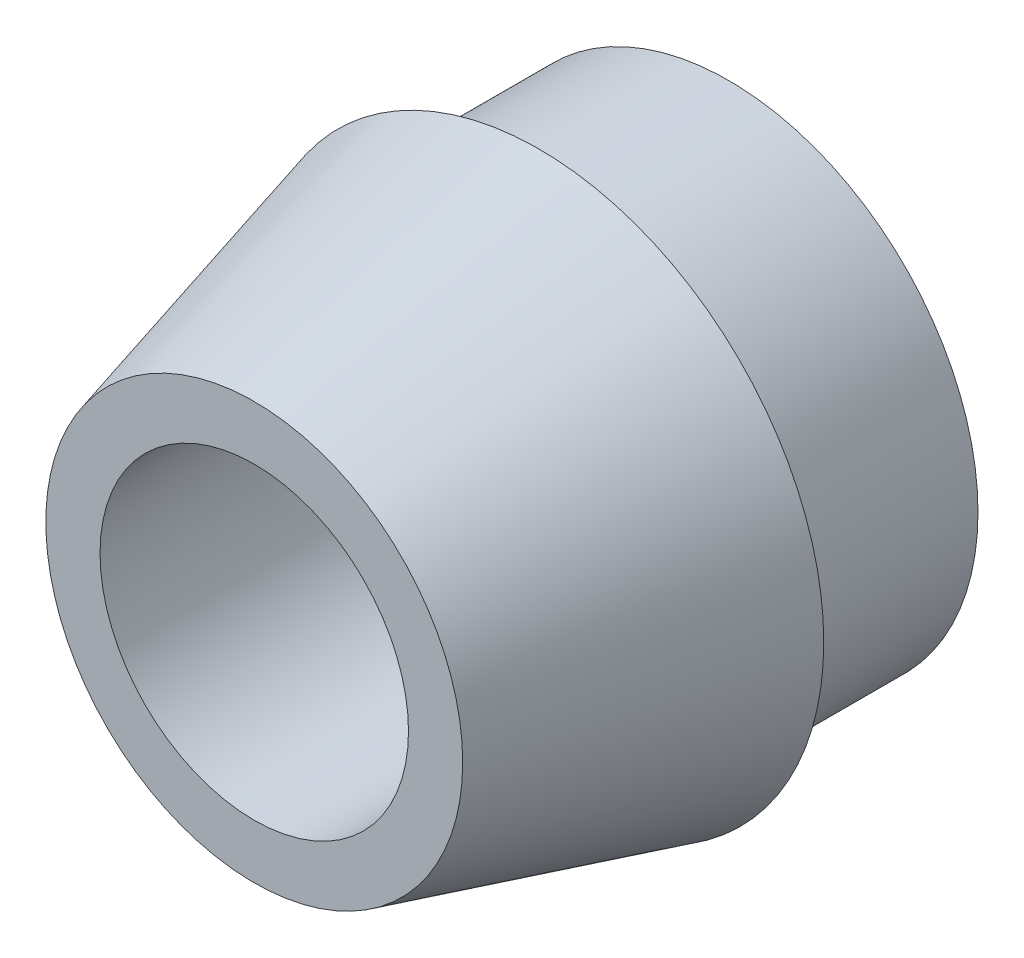
ISO-10303-21;
HEADER;
FILE_DESCRIPTION(('STEP AP214'),'2;1');
FILE_NAME('part.step','',(''),(''),'','','');
FILE_SCHEMA(('AUTOMOTIVE_DESIGN { 1 0 10303 214 1 1 1 1 }'));
ENDSEC;
DATA;
#1=APPLICATION_CONTEXT('core data for automotive mechanical design processes');
#2=APPLICATION_PROTOCOL_DEFINITION('international standard','automotive_design',2000,#1);
#3=PRODUCT_CONTEXT('',#1,'mechanical');
#4=PRODUCT('Part','Part','',(#3));
#5=PRODUCT_RELATED_PRODUCT_CATEGORY('part','',(#4));
#6=PRODUCT_DEFINITION_FORMATION('','',#4);
#7=PRODUCT_DEFINITION_CONTEXT('part definition',#1,'design');
#8=PRODUCT_DEFINITION('design','',#6,#7);
#9=PRODUCT_DEFINITION_SHAPE('','',#8);
#10=(LENGTH_UNIT() NAMED_UNIT(*) SI_UNIT(.MILLI.,.METRE.));
#11=(NAMED_UNIT(*) PLANE_ANGLE_UNIT() SI_UNIT($,.RADIAN.));
#12=(NAMED_UNIT(*) SI_UNIT($,.STERADIAN.) SOLID_ANGLE_UNIT());
#13=UNCERTAINTY_MEASURE_WITH_UNIT(LENGTH_MEASURE(1.E-05),#10,'distance_accuracy_value','');
#14=(GEOMETRIC_REPRESENTATION_CONTEXT(3) GLOBAL_UNCERTAINTY_ASSIGNED_CONTEXT((#13)) GLOBAL_UNIT_ASSIGNED_CONTEXT((#10,
#11,#12)) REPRESENTATION_CONTEXT('',''));
#15=CARTESIAN_POINT('',(0.,0.,0.));
#16=DIRECTION('',(0.,0.,1.));
#17=DIRECTION('',(1.,0.,0.));
#18=AXIS2_PLACEMENT_3D('',#15,#16,#17);
#19=CARTESIAN_POINT('',(0.,0.,0.));
#20=DIRECTION('',(0.,0.,1.));
#21=DIRECTION('',(1.,0.,0.));
#22=AXIS2_PLACEMENT_3D('',#19,#20,#21);
#23=PLANE('',#22);
#24=CARTESIAN_POINT('',(0.,0.,0.));
#25=DIRECTION('',(0.,0.,1.));
#26=DIRECTION('',(1.,0.,0.));
#27=AXIS2_PLACEMENT_3D('',#24,#25,#26);
#28=CIRCLE('',#27,52.5);
#29=CARTESIAN_POINT('',(52.5,0.,0.));
#30=VERTEX_POINT('',#29);
#31=EDGE_CURVE('E44',#30,#30,#28,.T.);
#32=ORIENTED_EDGE('',*,*,#31,.F.);
#33=EDGE_LOOP('',(#32));
#34=FACE_BOUND('',#33,.T.);
#35=CARTESIAN_POINT('',(0.,0.,0.));
#36=DIRECTION('',(0.,0.,1.));
#37=DIRECTION('',(1.,0.,0.));
#38=AXIS2_PLACEMENT_3D('',#35,#36,#37);
#39=CIRCLE('',#38,41.35);
#40=CARTESIAN_POINT('',(41.35,0.,0.));
#41=VERTEX_POINT('',#40);
#42=EDGE_CURVE('E51',#41,#41,#39,.T.);
#43=ORIENTED_EDGE('',*,*,#42,.T.);
#44=EDGE_LOOP('',(#43));
#45=FACE_BOUND('',#44,.T.);
#46=ADVANCED_FACE('F40',(#34,#45),#23,.F.);
#47=CARTESIAN_POINT('',(0.,0.,40.));
#48=DIRECTION('',(0.,0.,-1.));
#49=DIRECTION('',(-1.,0.,0.));
#50=AXIS2_PLACEMENT_3D('',#47,#48,#49);
#51=CYLINDRICAL_SURFACE('',#50,52.5);
#52=CARTESIAN_POINT('',(0.,0.,40.));
#53=DIRECTION('',(0.,0.,1.));
#54=DIRECTION('',(1.,0.,0.));
#55=AXIS2_PLACEMENT_3D('',#52,#53,#54);
#56=CIRCLE('',#55,52.5);
#57=CARTESIAN_POINT('',(52.5,0.,40.));
#58=VERTEX_POINT('',#57);
#59=EDGE_CURVE('E10',#58,#58,#56,.T.);
#60=ORIENTED_EDGE('',*,*,#59,.F.);
#61=EDGE_LOOP('',(#60));
#62=FACE_BOUND('',#61,.T.);
#63=ORIENTED_EDGE('',*,*,#31,.T.);
#64=EDGE_LOOP('',(#63));
#65=FACE_BOUND('',#64,.T.);
#66=ADVANCED_FACE('F42',(#62,#65),#51,.T.);
#67=CARTESIAN_POINT('',(0.,0.,40.));
#68=DIRECTION('',(0.,0.,-1.));
#69=DIRECTION('',(-1.,0.,0.));
#70=AXIS2_PLACEMENT_3D('',#67,#68,#69);
#71=CYLINDRICAL_SURFACE('',#70,41.35);
#72=CARTESIAN_POINT('',(0.,0.,40.));
#73=DIRECTION('',(0.,0.,1.));
#74=DIRECTION('',(1.,0.,0.));
#75=AXIS2_PLACEMENT_3D('',#72,#73,#74);
#76=CIRCLE('',#75,41.35);
#77=CARTESIAN_POINT('',(41.35,0.,40.));
#78=VERTEX_POINT('',#77);
#79=EDGE_CURVE('E55',#78,#78,#76,.T.);
#80=ORIENTED_EDGE('',*,*,#79,.T.);
#81=EDGE_LOOP('',(#80));
#82=FACE_BOUND('',#81,.T.);
#83=ORIENTED_EDGE('',*,*,#42,.F.);
#84=EDGE_LOOP('',(#83));
#85=FACE_BOUND('',#84,.T.);
#86=ADVANCED_FACE('F95',(#82,#85),#71,.F.);
#87=CARTESIAN_POINT('',(0.,0.,40.));
#88=DIRECTION('',(0.,0.,1.));
#89=DIRECTION('',(1.,0.,0.));
#90=AXIS2_PLACEMENT_3D('',#87,#88,#89);
#91=PLANE('',#90);
#92=CARTESIAN_POINT('',(0.,0.,40.));
#93=DIRECTION('',(0.,0.,1.));
#94=DIRECTION('',(1.,0.,0.));
#95=AXIS2_PLACEMENT_3D('',#92,#93,#94);
#96=CIRCLE('',#95,32.5);
#97=CARTESIAN_POINT('',(32.5,0.,40.));
#98=VERTEX_POINT('',#97);
#99=EDGE_CURVE('E64',#98,#98,#96,.T.);
#100=ORIENTED_EDGE('',*,*,#99,.T.);
#101=EDGE_LOOP('',(#100));
#102=FACE_BOUND('',#101,.T.);
#103=ORIENTED_EDGE('',*,*,#79,.F.);
#104=EDGE_LOOP('',(#103));
#105=FACE_BOUND('',#104,.T.);
#106=ADVANCED_FACE('F84',(#102,#105),#91,.F.);
#107=CARTESIAN_POINT('',(0.,0.,40.));
#108=DIRECTION('',(0.,0.,-1.));
#109=DIRECTION('',(1.,0.,0.));
#110=AXIS2_PLACEMENT_3D('',#107,#108,#109);
#111=CONICAL_SURFACE('',#110,60.,0.26179938779915);
#112=CARTESIAN_POINT('',(0.,0.,100.));
#113=DIRECTION('',(0.,0.,1.));
#114=DIRECTION('',(1.,0.,0.));
#115=AXIS2_PLACEMENT_3D('',#112,#113,#114);
#116=CIRCLE('',#115,43.9230484541326);
#117=CARTESIAN_POINT('',(43.9230484541326,0.,100.));
#118=VERTEX_POINT('',#117);
#119=EDGE_CURVE('E58',#118,#118,#116,.T.);
#120=ORIENTED_EDGE('',*,*,#119,.F.);
#121=EDGE_LOOP('',(#120));
#122=FACE_BOUND('',#121,.T.);
#123=CARTESIAN_POINT('',(0.,0.,40.));
#124=DIRECTION('',(0.,0.,1.));
#125=DIRECTION('',(1.,0.,0.));
#126=AXIS2_PLACEMENT_3D('',#123,#124,#125);
#127=CIRCLE('',#126,60.);
#128=CARTESIAN_POINT('',(60.,0.,40.));
#129=VERTEX_POINT('',#128);
#130=EDGE_CURVE('E61',#129,#129,#127,.T.);
#131=ORIENTED_EDGE('',*,*,#130,.T.);
#132=EDGE_LOOP('',(#131));
#133=FACE_BOUND('',#132,.T.);
#134=ADVANCED_FACE('F78',(#122,#133),#111,.T.);
#135=CARTESIAN_POINT('',(0.,0.,100.));
#136=DIRECTION('',(0.,0.,1.));
#137=DIRECTION('',(1.,0.,0.));
#138=AXIS2_PLACEMENT_3D('',#135,#136,#137);
#139=PLANE('',#138);
#140=CARTESIAN_POINT('',(0.,0.,100.));
#141=DIRECTION('',(0.,0.,1.));
#142=DIRECTION('',(1.,0.,0.));
#143=AXIS2_PLACEMENT_3D('',#140,#141,#142);
#144=CIRCLE('',#143,32.5);
#145=CARTESIAN_POINT('',(32.5,0.,100.));
#146=VERTEX_POINT('',#145);
#147=EDGE_CURVE('E67',#146,#146,#144,.T.);
#148=ORIENTED_EDGE('',*,*,#147,.F.);
#149=EDGE_LOOP('',(#148));
#150=FACE_BOUND('',#149,.T.);
#151=ORIENTED_EDGE('',*,*,#119,.T.);
#152=EDGE_LOOP('',(#151));
#153=FACE_BOUND('',#152,.T.);
#154=ADVANCED_FACE('F74',(#150,#153),#139,.T.);
#155=ORIENTED_EDGE('',*,*,#59,.T.);
#156=EDGE_LOOP('',(#155));
#157=FACE_BOUND('',#156,.T.);
#158=ORIENTED_EDGE('',*,*,#130,.F.);
#159=EDGE_LOOP('',(#158));
#160=FACE_BOUND('',#159,.T.);
#161=ADVANCED_FACE('F77',(#157,#160),#91,.F.);
#162=CARTESIAN_POINT('',(0.,0.,0.));
#163=DIRECTION('',(0.,0.,1.));
#164=DIRECTION('',(1.,0.,0.));
#165=AXIS2_PLACEMENT_3D('',#162,#163,#164);
#166=CYLINDRICAL_SURFACE('',#165,32.5);
#167=ORIENTED_EDGE('',*,*,#147,.T.);
#168=EDGE_LOOP('',(#167));
#169=FACE_BOUND('',#168,.T.);
#170=ORIENTED_EDGE('',*,*,#99,.F.);
#171=EDGE_LOOP('',(#170));
#172=FACE_BOUND('',#171,.T.);
#173=ADVANCED_FACE('F71',(#169,#172),#166,.F.);
#174=CLOSED_SHELL('',(#46,#66,#86,#106,#134,#154,#161,#173));
#175=MANIFOLD_SOLID_BREP('B2',#174);
#176=ADVANCED_BREP_SHAPE_REPRESENTATION('',(#18,#175),#14);
#177=SHAPE_DEFINITION_REPRESENTATION(#9,#176);
ENDSEC;
END-ISO-10303-21;
